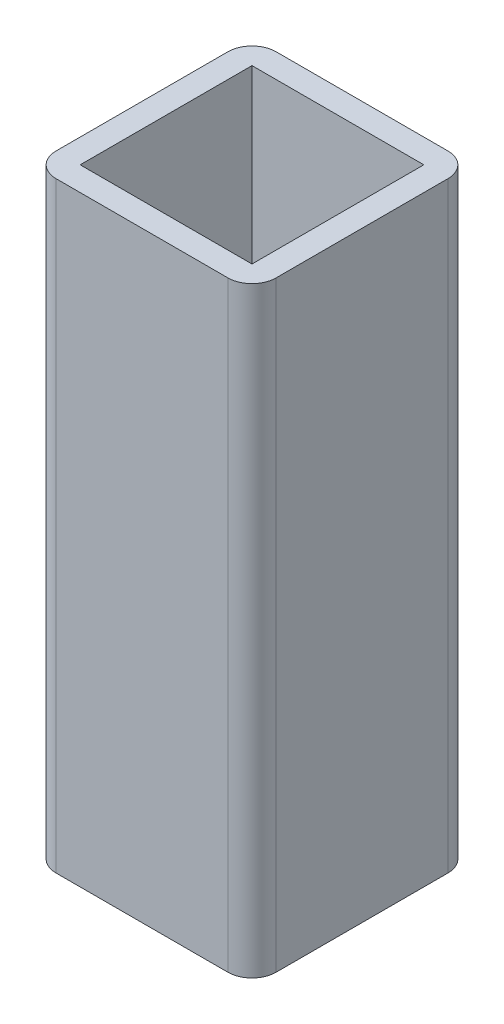
ISO-10303-21;
HEADER;
FILE_DESCRIPTION(('STEP AP214'),'2;1');
FILE_NAME('part.step','',(''),(''),'','','');
FILE_SCHEMA(('AUTOMOTIVE_DESIGN { 1 0 10303 214 1 1 1 1 }'));
ENDSEC;
DATA;
#1=APPLICATION_CONTEXT('core data for automotive mechanical design processes');
#2=APPLICATION_PROTOCOL_DEFINITION('international standard','automotive_design',2000,#1);
#3=PRODUCT_CONTEXT('',#1,'mechanical');
#4=PRODUCT('Part','Part','',(#3));
#5=PRODUCT_RELATED_PRODUCT_CATEGORY('part','',(#4));
#6=PRODUCT_DEFINITION_FORMATION('','',#4);
#7=PRODUCT_DEFINITION_CONTEXT('part definition',#1,'design');
#8=PRODUCT_DEFINITION('design','',#6,#7);
#9=PRODUCT_DEFINITION_SHAPE('','',#8);
#10=(LENGTH_UNIT() NAMED_UNIT(*) SI_UNIT(.MILLI.,.METRE.));
#11=(NAMED_UNIT(*) PLANE_ANGLE_UNIT() SI_UNIT($,.RADIAN.));
#12=(NAMED_UNIT(*) SI_UNIT($,.STERADIAN.) SOLID_ANGLE_UNIT());
#13=UNCERTAINTY_MEASURE_WITH_UNIT(LENGTH_MEASURE(1.E-05),#10,'distance_accuracy_value','');
#14=(GEOMETRIC_REPRESENTATION_CONTEXT(3) GLOBAL_UNCERTAINTY_ASSIGNED_CONTEXT((#13)) GLOBAL_UNIT_ASSIGNED_CONTEXT((#10,
#11,#12)) REPRESENTATION_CONTEXT('',''));
#15=CARTESIAN_POINT('',(0.,0.,0.));
#16=DIRECTION('',(0.,0.,1.));
#17=DIRECTION('',(1.,0.,0.));
#18=AXIS2_PLACEMENT_3D('',#15,#16,#17);
#19=CARTESIAN_POINT('',(22.8,70.,2.8));
#20=DIRECTION('',(0.,-1.,0.));
#21=DIRECTION('',(0.,0.,-1.));
#22=AXIS2_PLACEMENT_3D('',#19,#20,#21);
#23=CYLINDRICAL_SURFACE('',#22,2.8);
#24=CARTESIAN_POINT('',(22.8,0.,2.8));
#25=DIRECTION('',(0.,1.,0.));
#26=DIRECTION('',(0.,0.,-1.));
#27=AXIS2_PLACEMENT_3D('',#24,#25,#26);
#28=CIRCLE('',#27,2.8);
#29=CARTESIAN_POINT('',(25.6,0.,2.80000000000002));
#30=VERTEX_POINT('',#29);
#31=CARTESIAN_POINT('',(22.8,0.,0.));
#32=VERTEX_POINT('',#31);
#33=EDGE_CURVE('E157',#30,#32,#28,.T.);
#34=ORIENTED_EDGE('',*,*,#33,.T.);
#35=DIRECTION('',(0.,-1.,0.));
#36=VECTOR('',#35,1.);
#37=CARTESIAN_POINT('',(22.8,70.,0.));
#38=LINE('',#37,#36);
#39=CARTESIAN_POINT('',(22.8,70.,0.));
#40=VERTEX_POINT('',#39);
#41=EDGE_CURVE('E11',#40,#32,#38,.T.);
#42=ORIENTED_EDGE('',*,*,#41,.F.);
#43=CARTESIAN_POINT('',(22.8,70.,2.8));
#44=DIRECTION('',(0.,1.,0.));
#45=DIRECTION('',(0.,0.,-1.));
#46=AXIS2_PLACEMENT_3D('',#43,#44,#45);
#47=CIRCLE('',#46,2.8);
#48=CARTESIAN_POINT('',(25.6,70.,2.80000000000002));
#49=VERTEX_POINT('',#48);
#50=EDGE_CURVE('E158',#49,#40,#47,.T.);
#51=ORIENTED_EDGE('',*,*,#50,.F.);
#52=DIRECTION('',(0.,-1.,0.));
#53=VECTOR('',#52,1.);
#54=CARTESIAN_POINT('',(25.6,70.,2.80000000000002));
#55=LINE('',#54,#53);
#56=EDGE_CURVE('E176',#49,#30,#55,.T.);
#57=ORIENTED_EDGE('',*,*,#56,.T.);
#58=EDGE_LOOP('',(#34,#42,#51,#57));
#59=FACE_BOUND('',#58,.T.);
#60=ADVANCED_FACE('F32',(#59),#23,.T.);
#61=CARTESIAN_POINT('',(2.80000000000002,70.,0.));
#62=DIRECTION('',(0.,0.,1.));
#63=DIRECTION('',(1.,0.,0.));
#64=AXIS2_PLACEMENT_3D('',#61,#62,#63);
#65=PLANE('',#64);
#66=DIRECTION('',(-1.,0.,0.));
#67=VECTOR('',#66,1.);
#68=CARTESIAN_POINT('',(2.80000000000002,0.,0.));
#69=LINE('',#68,#67);
#70=CARTESIAN_POINT('',(2.80000000000002,0.,0.));
#71=VERTEX_POINT('',#70);
#72=EDGE_CURVE('E179',#32,#71,#69,.T.);
#73=ORIENTED_EDGE('',*,*,#72,.T.);
#74=DIRECTION('',(0.,-1.,0.));
#75=VECTOR('',#74,1.);
#76=CARTESIAN_POINT('',(2.80000000000002,70.,0.));
#77=LINE('',#76,#75);
#78=CARTESIAN_POINT('',(2.80000000000002,70.,0.));
#79=VERTEX_POINT('',#78);
#80=EDGE_CURVE('E39',#79,#71,#77,.T.);
#81=ORIENTED_EDGE('',*,*,#80,.F.);
#82=DIRECTION('',(-1.,0.,0.));
#83=VECTOR('',#82,1.);
#84=CARTESIAN_POINT('',(2.80000000000002,70.,0.));
#85=LINE('',#84,#83);
#86=EDGE_CURVE('E161',#40,#79,#85,.T.);
#87=ORIENTED_EDGE('',*,*,#86,.F.);
#88=ORIENTED_EDGE('',*,*,#41,.T.);
#89=EDGE_LOOP('',(#73,#81,#87,#88));
#90=FACE_BOUND('',#89,.T.);
#91=ADVANCED_FACE('F234',(#90),#65,.F.);
#92=CARTESIAN_POINT('',(2.8,70.,2.8));
#93=DIRECTION('',(0.,-1.,0.));
#94=DIRECTION('',(0.,0.,-1.));
#95=AXIS2_PLACEMENT_3D('',#92,#93,#94);
#96=CYLINDRICAL_SURFACE('',#95,2.8);
#97=CARTESIAN_POINT('',(2.8,0.,2.8));
#98=DIRECTION('',(0.,1.,0.));
#99=DIRECTION('',(0.,0.,1.));
#100=AXIS2_PLACEMENT_3D('',#97,#98,#99);
#101=CIRCLE('',#100,2.8);
#102=CARTESIAN_POINT('',(0.,0.,2.80000000000002));
#103=VERTEX_POINT('',#102);
#104=EDGE_CURVE('E181',#71,#103,#101,.T.);
#105=ORIENTED_EDGE('',*,*,#104,.T.);
#106=DIRECTION('',(0.,-1.,0.));
#107=VECTOR('',#106,1.);
#108=CARTESIAN_POINT('',(0.,70.,2.80000000000002));
#109=LINE('',#108,#107);
#110=CARTESIAN_POINT('',(0.,70.,2.80000000000002));
#111=VERTEX_POINT('',#110);
#112=EDGE_CURVE('E206',#111,#103,#109,.T.);
#113=ORIENTED_EDGE('',*,*,#112,.F.);
#114=CARTESIAN_POINT('',(2.8,70.,2.8));
#115=DIRECTION('',(0.,1.,0.));
#116=DIRECTION('',(0.,0.,1.));
#117=AXIS2_PLACEMENT_3D('',#114,#115,#116);
#118=CIRCLE('',#117,2.8);
#119=EDGE_CURVE('E164',#79,#111,#118,.T.);
#120=ORIENTED_EDGE('',*,*,#119,.F.);
#121=ORIENTED_EDGE('',*,*,#80,.T.);
#122=EDGE_LOOP('',(#105,#113,#120,#121));
#123=FACE_BOUND('',#122,.T.);
#124=ADVANCED_FACE('F213',(#123),#96,.T.);
#125=CARTESIAN_POINT('',(0.,70.,2.80000000000002));
#126=DIRECTION('',(1.,0.,0.));
#127=DIRECTION('',(0.,0.,-1.));
#128=AXIS2_PLACEMENT_3D('',#125,#126,#127);
#129=PLANE('',#128);
#130=DIRECTION('',(0.,0.,1.));
#131=VECTOR('',#130,1.);
#132=CARTESIAN_POINT('',(0.,0.,2.80000000000002));
#133=LINE('',#132,#131);
#134=CARTESIAN_POINT('',(0.,0.,22.8));
#135=VERTEX_POINT('',#134);
#136=EDGE_CURVE('E183',#103,#135,#133,.T.);
#137=ORIENTED_EDGE('',*,*,#136,.T.);
#138=DIRECTION('',(0.,-1.,0.));
#139=VECTOR('',#138,1.);
#140=CARTESIAN_POINT('',(0.,70.,22.8));
#141=LINE('',#140,#139);
#142=CARTESIAN_POINT('',(0.,70.,22.8));
#143=VERTEX_POINT('',#142);
#144=EDGE_CURVE('E203',#143,#135,#141,.T.);
#145=ORIENTED_EDGE('',*,*,#144,.F.);
#146=DIRECTION('',(0.,0.,1.));
#147=VECTOR('',#146,1.);
#148=CARTESIAN_POINT('',(0.,70.,2.80000000000002));
#149=LINE('',#148,#147);
#150=EDGE_CURVE('E166',#111,#143,#149,.T.);
#151=ORIENTED_EDGE('',*,*,#150,.F.);
#152=ORIENTED_EDGE('',*,*,#112,.T.);
#153=EDGE_LOOP('',(#137,#145,#151,#152));
#154=FACE_BOUND('',#153,.T.);
#155=ADVANCED_FACE('F222',(#154),#129,.F.);
#156=CARTESIAN_POINT('',(2.8,70.,22.8));
#157=DIRECTION('',(0.,-1.,0.));
#158=DIRECTION('',(0.,0.,-1.));
#159=AXIS2_PLACEMENT_3D('',#156,#157,#158);
#160=CYLINDRICAL_SURFACE('',#159,2.8);
#161=CARTESIAN_POINT('',(2.8,0.,22.8));
#162=DIRECTION('',(0.,1.,0.));
#163=DIRECTION('',(0.,0.,1.));
#164=AXIS2_PLACEMENT_3D('',#161,#162,#163);
#165=CIRCLE('',#164,2.8);
#166=CARTESIAN_POINT('',(2.80000000000002,0.,25.6));
#167=VERTEX_POINT('',#166);
#168=EDGE_CURVE('E185',#135,#167,#165,.T.);
#169=ORIENTED_EDGE('',*,*,#168,.T.);
#170=DIRECTION('',(0.,-1.,0.));
#171=VECTOR('',#170,1.);
#172=CARTESIAN_POINT('',(2.80000000000002,70.,25.6));
#173=LINE('',#172,#171);
#174=CARTESIAN_POINT('',(2.80000000000002,70.,25.6));
#175=VERTEX_POINT('',#174);
#176=EDGE_CURVE('E200',#175,#167,#173,.T.);
#177=ORIENTED_EDGE('',*,*,#176,.F.);
#178=CARTESIAN_POINT('',(2.8,70.,22.8));
#179=DIRECTION('',(0.,1.,0.));
#180=DIRECTION('',(0.,0.,1.));
#181=AXIS2_PLACEMENT_3D('',#178,#179,#180);
#182=CIRCLE('',#181,2.8);
#183=EDGE_CURVE('E168',#143,#175,#182,.T.);
#184=ORIENTED_EDGE('',*,*,#183,.F.);
#185=ORIENTED_EDGE('',*,*,#144,.T.);
#186=EDGE_LOOP('',(#169,#177,#184,#185));
#187=FACE_BOUND('',#186,.T.);
#188=ADVANCED_FACE('F226',(#187),#160,.T.);
#189=CARTESIAN_POINT('',(2.80000000000002,70.,25.6));
#190=DIRECTION('',(0.,0.,-1.));
#191=DIRECTION('',(-1.,0.,0.));
#192=AXIS2_PLACEMENT_3D('',#189,#190,#191);
#193=PLANE('',#192);
#194=DIRECTION('',(1.,0.,0.));
#195=VECTOR('',#194,1.);
#196=CARTESIAN_POINT('',(2.80000000000002,0.,25.6));
#197=LINE('',#196,#195);
#198=CARTESIAN_POINT('',(22.8,0.,25.6));
#199=VERTEX_POINT('',#198);
#200=EDGE_CURVE('E187',#167,#199,#197,.T.);
#201=ORIENTED_EDGE('',*,*,#200,.T.);
#202=DIRECTION('',(0.,-1.,0.));
#203=VECTOR('',#202,1.);
#204=CARTESIAN_POINT('',(22.8,70.,25.6));
#205=LINE('',#204,#203);
#206=CARTESIAN_POINT('',(22.8,70.,25.6));
#207=VERTEX_POINT('',#206);
#208=EDGE_CURVE('E197',#207,#199,#205,.T.);
#209=ORIENTED_EDGE('',*,*,#208,.F.);
#210=DIRECTION('',(1.,0.,0.));
#211=VECTOR('',#210,1.);
#212=CARTESIAN_POINT('',(2.80000000000002,70.,25.6));
#213=LINE('',#212,#211);
#214=EDGE_CURVE('E170',#175,#207,#213,.T.);
#215=ORIENTED_EDGE('',*,*,#214,.F.);
#216=ORIENTED_EDGE('',*,*,#176,.T.);
#217=EDGE_LOOP('',(#201,#209,#215,#216));
#218=FACE_BOUND('',#217,.T.);
#219=ADVANCED_FACE('F247',(#218),#193,.F.);
#220=CARTESIAN_POINT('',(22.8,70.,22.8));
#221=DIRECTION('',(0.,-1.,0.));
#222=DIRECTION('',(0.,0.,-1.));
#223=AXIS2_PLACEMENT_3D('',#220,#221,#222);
#224=CYLINDRICAL_SURFACE('',#223,2.8);
#225=CARTESIAN_POINT('',(22.8,0.,22.8));
#226=DIRECTION('',(0.,1.,0.));
#227=DIRECTION('',(0.,0.,1.));
#228=AXIS2_PLACEMENT_3D('',#225,#226,#227);
#229=CIRCLE('',#228,2.8);
#230=CARTESIAN_POINT('',(25.6,0.,22.8));
#231=VERTEX_POINT('',#230);
#232=EDGE_CURVE('E189',#199,#231,#229,.T.);
#233=ORIENTED_EDGE('',*,*,#232,.T.);
#234=DIRECTION('',(0.,-1.,0.));
#235=VECTOR('',#234,1.);
#236=CARTESIAN_POINT('',(25.6,70.,22.8));
#237=LINE('',#236,#235);
#238=CARTESIAN_POINT('',(25.6,70.,22.8));
#239=VERTEX_POINT('',#238);
#240=EDGE_CURVE('E194',#239,#231,#237,.T.);
#241=ORIENTED_EDGE('',*,*,#240,.F.);
#242=CARTESIAN_POINT('',(22.8,70.,22.8));
#243=DIRECTION('',(0.,1.,0.));
#244=DIRECTION('',(0.,0.,1.));
#245=AXIS2_PLACEMENT_3D('',#242,#243,#244);
#246=CIRCLE('',#245,2.8);
#247=EDGE_CURVE('E172',#207,#239,#246,.T.);
#248=ORIENTED_EDGE('',*,*,#247,.F.);
#249=ORIENTED_EDGE('',*,*,#208,.T.);
#250=EDGE_LOOP('',(#233,#241,#248,#249));
#251=FACE_BOUND('',#250,.T.);
#252=ADVANCED_FACE('F245',(#251),#224,.T.);
#253=CARTESIAN_POINT('',(25.6,70.,2.80000000000002));
#254=DIRECTION('',(-1.,0.,0.));
#255=DIRECTION('',(0.,0.,1.));
#256=AXIS2_PLACEMENT_3D('',#253,#254,#255);
#257=PLANE('',#256);
#258=DIRECTION('',(0.,0.,-1.));
#259=VECTOR('',#258,1.);
#260=CARTESIAN_POINT('',(25.6,0.,2.80000000000002));
#261=LINE('',#260,#259);
#262=EDGE_CURVE('E162',#231,#30,#261,.T.);
#263=ORIENTED_EDGE('',*,*,#262,.T.);
#264=ORIENTED_EDGE('',*,*,#56,.F.);
#265=DIRECTION('',(0.,0.,-1.));
#266=VECTOR('',#265,1.);
#267=CARTESIAN_POINT('',(25.6,70.,2.80000000000002));
#268=LINE('',#267,#266);
#269=EDGE_CURVE('E174',#239,#49,#268,.T.);
#270=ORIENTED_EDGE('',*,*,#269,.F.);
#271=ORIENTED_EDGE('',*,*,#240,.T.);
#272=EDGE_LOOP('',(#263,#264,#270,#271));
#273=FACE_BOUND('',#272,.T.);
#274=ADVANCED_FACE('F240',(#273),#257,.F.);
#275=CARTESIAN_POINT('',(22.8,70.,2.8));
#276=DIRECTION('',(0.,-1.,0.));
#277=DIRECTION('',(0.,0.,-1.));
#278=AXIS2_PLACEMENT_3D('',#275,#276,#277);
#279=PLANE('',#278);
#280=DIRECTION('',(1.,0.,0.));
#281=VECTOR('',#280,1.);
#282=CARTESIAN_POINT('',(22.8,70.,2.8));
#283=LINE('',#282,#281);
#284=CARTESIAN_POINT('',(2.8,70.0000000000001,2.8));
#285=VERTEX_POINT('',#284);
#286=CARTESIAN_POINT('',(22.8,70.0000000000001,2.8));
#287=VERTEX_POINT('',#286);
#288=EDGE_CURVE('E151',#285,#287,#283,.T.);
#289=ORIENTED_EDGE('',*,*,#288,.T.);
#290=DIRECTION('',(0.,0.,1.));
#291=VECTOR('',#290,1.);
#292=CARTESIAN_POINT('',(22.8,70.,2.8));
#293=LINE('',#292,#291);
#294=CARTESIAN_POINT('',(22.8,70.0000000000001,22.8));
#295=VERTEX_POINT('',#294);
#296=EDGE_CURVE('E154',#287,#295,#293,.T.);
#297=ORIENTED_EDGE('',*,*,#296,.T.);
#298=DIRECTION('',(-1.,0.,0.));
#299=VECTOR('',#298,1.);
#300=CARTESIAN_POINT('',(22.8,70.,22.8));
#301=LINE('',#300,#299);
#302=CARTESIAN_POINT('',(2.8,70.,22.8));
#303=VERTEX_POINT('',#302);
#304=EDGE_CURVE('E146',#295,#303,#301,.T.);
#305=ORIENTED_EDGE('',*,*,#304,.T.);
#306=DIRECTION('',(0.,0.,-1.));
#307=VECTOR('',#306,1.);
#308=CARTESIAN_POINT('',(2.8,70.,2.79999999999999));
#309=LINE('',#308,#307);
#310=EDGE_CURVE('E126',#303,#285,#309,.T.);
#311=ORIENTED_EDGE('',*,*,#310,.T.);
#312=EDGE_LOOP('',(#289,#297,#305,#311));
#313=FACE_BOUND('',#312,.T.);
#314=ORIENTED_EDGE('',*,*,#50,.T.);
#315=ORIENTED_EDGE('',*,*,#86,.T.);
#316=ORIENTED_EDGE('',*,*,#119,.T.);
#317=ORIENTED_EDGE('',*,*,#150,.T.);
#318=ORIENTED_EDGE('',*,*,#183,.T.);
#319=ORIENTED_EDGE('',*,*,#214,.T.);
#320=ORIENTED_EDGE('',*,*,#247,.T.);
#321=ORIENTED_EDGE('',*,*,#269,.T.);
#322=EDGE_LOOP('',(#314,#315,#316,#317,#318,#319,#320,#321));
#323=FACE_BOUND('',#322,.T.);
#324=ADVANCED_FACE('F230',(#313,#323),#279,.F.);
#325=CARTESIAN_POINT('',(22.8,0.,2.8));
#326=DIRECTION('',(0.,-1.,0.));
#327=DIRECTION('',(0.,0.,-1.));
#328=AXIS2_PLACEMENT_3D('',#325,#326,#327);
#329=PLANE('',#328);
#330=DIRECTION('',(0.,0.,1.));
#331=VECTOR('',#330,1.);
#332=CARTESIAN_POINT('',(22.8,0.,2.8));
#333=LINE('',#332,#331);
#334=CARTESIAN_POINT('',(22.8,0.,2.8));
#335=VERTEX_POINT('',#334);
#336=CARTESIAN_POINT('',(22.8,0.,22.8));
#337=VERTEX_POINT('',#336);
#338=EDGE_CURVE('E54',#335,#337,#333,.T.);
#339=ORIENTED_EDGE('',*,*,#338,.F.);
#340=DIRECTION('',(1.,0.,0.));
#341=VECTOR('',#340,1.);
#342=CARTESIAN_POINT('',(2.8,0.,2.8));
#343=LINE('',#342,#341);
#344=CARTESIAN_POINT('',(2.8,0.,2.8));
#345=VERTEX_POINT('',#344);
#346=EDGE_CURVE('E139',#345,#335,#343,.T.);
#347=ORIENTED_EDGE('',*,*,#346,.F.);
#348=DIRECTION('',(0.,0.,-1.));
#349=VECTOR('',#348,1.);
#350=CARTESIAN_POINT('',(2.8,0.,2.8));
#351=LINE('',#350,#349);
#352=CARTESIAN_POINT('',(2.8,0.,22.8));
#353=VERTEX_POINT('',#352);
#354=EDGE_CURVE('E123',#353,#345,#351,.T.);
#355=ORIENTED_EDGE('',*,*,#354,.F.);
#356=DIRECTION('',(-1.,0.,0.));
#357=VECTOR('',#356,1.);
#358=CARTESIAN_POINT('',(2.8,0.,22.8));
#359=LINE('',#358,#357);
#360=EDGE_CURVE('E132',#337,#353,#359,.T.);
#361=ORIENTED_EDGE('',*,*,#360,.F.);
#362=EDGE_LOOP('',(#339,#347,#355,#361));
#363=FACE_BOUND('',#362,.T.);
#364=ORIENTED_EDGE('',*,*,#33,.F.);
#365=ORIENTED_EDGE('',*,*,#262,.F.);
#366=ORIENTED_EDGE('',*,*,#232,.F.);
#367=ORIENTED_EDGE('',*,*,#200,.F.);
#368=ORIENTED_EDGE('',*,*,#168,.F.);
#369=ORIENTED_EDGE('',*,*,#136,.F.);
#370=ORIENTED_EDGE('',*,*,#104,.F.);
#371=ORIENTED_EDGE('',*,*,#72,.F.);
#372=EDGE_LOOP('',(#364,#365,#366,#367,#368,#369,#370,#371));
#373=FACE_BOUND('',#372,.T.);
#374=ADVANCED_FACE('F136',(#363,#373),#329,.T.);
#375=CARTESIAN_POINT('',(22.8,1040.5,2.8));
#376=DIRECTION('',(1.,0.,0.));
#377=DIRECTION('',(0.,0.,-1.));
#378=AXIS2_PLACEMENT_3D('',#375,#376,#377);
#379=PLANE('',#378);
#380=DIRECTION('',(0.,-1.,0.));
#381=VECTOR('',#380,1.);
#382=CARTESIAN_POINT('',(22.8,1040.5,2.8));
#383=LINE('',#382,#381);
#384=EDGE_CURVE('E144',#287,#335,#383,.T.);
#385=ORIENTED_EDGE('',*,*,#384,.T.);
#386=ORIENTED_EDGE('',*,*,#338,.T.);
#387=DIRECTION('',(0.,-1.,0.));
#388=VECTOR('',#387,1.);
#389=CARTESIAN_POINT('',(22.8,1040.5,22.8));
#390=LINE('',#389,#388);
#391=EDGE_CURVE('E129',#295,#337,#390,.T.);
#392=ORIENTED_EDGE('',*,*,#391,.F.);
#393=ORIENTED_EDGE('',*,*,#296,.F.);
#394=EDGE_LOOP('',(#385,#386,#392,#393));
#395=FACE_BOUND('',#394,.T.);
#396=ADVANCED_FACE('F310',(#395),#379,.F.);
#397=CARTESIAN_POINT('',(2.8,1040.5,2.8));
#398=DIRECTION('',(0.,0.,-1.));
#399=DIRECTION('',(-1.,0.,0.));
#400=AXIS2_PLACEMENT_3D('',#397,#398,#399);
#401=PLANE('',#400);
#402=DIRECTION('',(0.,-1.,0.));
#403=VECTOR('',#402,1.);
#404=CARTESIAN_POINT('',(2.8,1040.5,2.8));
#405=LINE('',#404,#403);
#406=EDGE_CURVE('E128',#285,#345,#405,.T.);
#407=ORIENTED_EDGE('',*,*,#406,.T.);
#408=ORIENTED_EDGE('',*,*,#346,.T.);
#409=ORIENTED_EDGE('',*,*,#384,.F.);
#410=ORIENTED_EDGE('',*,*,#288,.F.);
#411=EDGE_LOOP('',(#407,#408,#409,#410));
#412=FACE_BOUND('',#411,.T.);
#413=ADVANCED_FACE('F319',(#412),#401,.F.);
#414=CARTESIAN_POINT('',(2.8,1040.5,2.8));
#415=DIRECTION('',(-1.,0.,0.));
#416=DIRECTION('',(0.,0.,1.));
#417=AXIS2_PLACEMENT_3D('',#414,#415,#416);
#418=PLANE('',#417);
#419=DIRECTION('',(0.,-1.,0.));
#420=VECTOR('',#419,1.);
#421=CARTESIAN_POINT('',(2.8,1040.5,22.8));
#422=LINE('',#421,#420);
#423=EDGE_CURVE('E46',#303,#353,#422,.T.);
#424=ORIENTED_EDGE('',*,*,#423,.T.);
#425=ORIENTED_EDGE('',*,*,#354,.T.);
#426=ORIENTED_EDGE('',*,*,#406,.F.);
#427=ORIENTED_EDGE('',*,*,#310,.F.);
#428=EDGE_LOOP('',(#424,#425,#426,#427));
#429=FACE_BOUND('',#428,.T.);
#430=ADVANCED_FACE('F120',(#429),#418,.F.);
#431=CARTESIAN_POINT('',(2.8,1040.5,22.8));
#432=DIRECTION('',(0.,0.,1.));
#433=DIRECTION('',(1.,0.,0.));
#434=AXIS2_PLACEMENT_3D('',#431,#432,#433);
#435=PLANE('',#434);
#436=ORIENTED_EDGE('',*,*,#391,.T.);
#437=ORIENTED_EDGE('',*,*,#360,.T.);
#438=ORIENTED_EDGE('',*,*,#423,.F.);
#439=ORIENTED_EDGE('',*,*,#304,.F.);
#440=EDGE_LOOP('',(#436,#437,#438,#439));
#441=FACE_BOUND('',#440,.T.);
#442=ADVANCED_FACE('F133',(#441),#435,.F.);
#443=CLOSED_SHELL('',(#60,#91,#124,#155,#188,#219,#252,#274,#324,#374,#396,#413,#430,#442));
#444=MANIFOLD_SOLID_BREP('B2',#443);
#445=ADVANCED_BREP_SHAPE_REPRESENTATION('',(#18,#444),#14);
#446=SHAPE_DEFINITION_REPRESENTATION(#9,#445);
ENDSEC;
END-ISO-10303-21;
